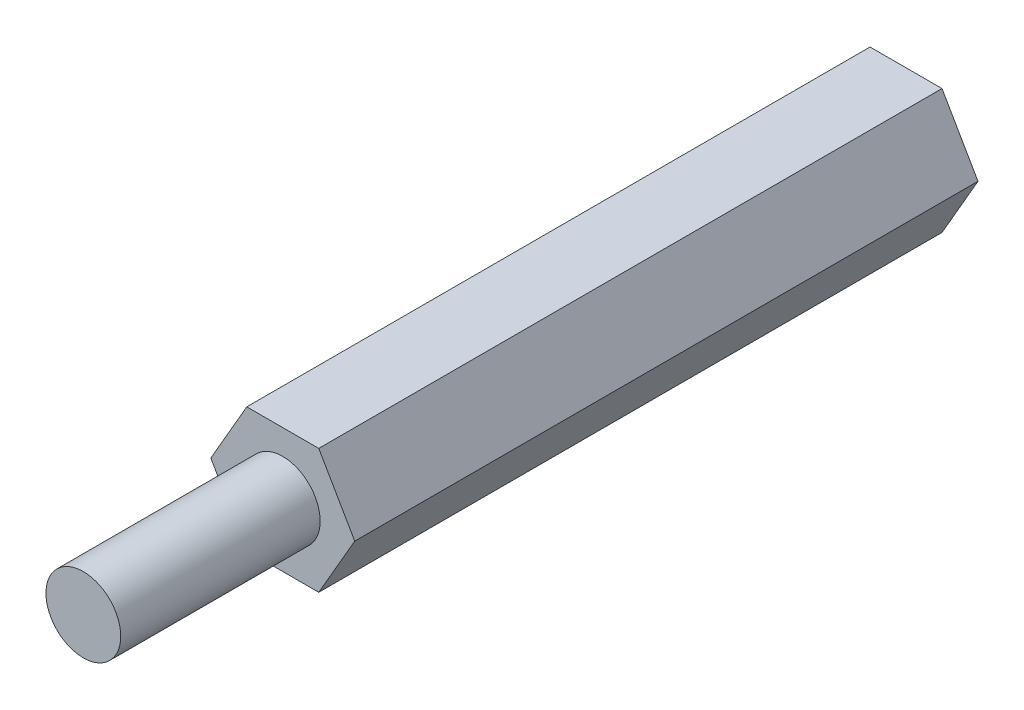
ISO-10303-21;
HEADER;
FILE_DESCRIPTION(('STEP AP214'),'2;1');
FILE_NAME('part.step','',(''),(''),'','','');
FILE_SCHEMA(('AUTOMOTIVE_DESIGN { 1 0 10303 214 1 1 1 1 }'));
ENDSEC;
DATA;
#1=APPLICATION_CONTEXT('core data for automotive mechanical design processes');
#2=APPLICATION_PROTOCOL_DEFINITION('international standard','automotive_design',2000,#1);
#3=PRODUCT_CONTEXT('',#1,'mechanical');
#4=PRODUCT('Part','Part','',(#3));
#5=PRODUCT_RELATED_PRODUCT_CATEGORY('part','',(#4));
#6=PRODUCT_DEFINITION_FORMATION('','',#4);
#7=PRODUCT_DEFINITION_CONTEXT('part definition',#1,'design');
#8=PRODUCT_DEFINITION('design','',#6,#7);
#9=PRODUCT_DEFINITION_SHAPE('','',#8);
#10=(LENGTH_UNIT() NAMED_UNIT(*) SI_UNIT(.MILLI.,.METRE.));
#11=(NAMED_UNIT(*) PLANE_ANGLE_UNIT() SI_UNIT($,.RADIAN.));
#12=(NAMED_UNIT(*) SI_UNIT($,.STERADIAN.) SOLID_ANGLE_UNIT());
#13=UNCERTAINTY_MEASURE_WITH_UNIT(LENGTH_MEASURE(1.E-05),#10,'distance_accuracy_value','');
#14=(GEOMETRIC_REPRESENTATION_CONTEXT(3) GLOBAL_UNCERTAINTY_ASSIGNED_CONTEXT((#13)) GLOBAL_UNIT_ASSIGNED_CONTEXT((#10,
#11,#12)) REPRESENTATION_CONTEXT('',''));
#15=CARTESIAN_POINT('',(0.,0.,0.));
#16=DIRECTION('',(0.,0.,1.));
#17=DIRECTION('',(1.,0.,0.));
#18=AXIS2_PLACEMENT_3D('',#15,#16,#17);
#19=CARTESIAN_POINT('',(1.44337567297409,-2.49999999999999,25.));
#20=DIRECTION('',(-0.866025403784442,0.499999999999995,0.));
#21=DIRECTION('',(-0.499999999999995,-0.866025403784442,0.));
#22=AXIS2_PLACEMENT_3D('',#19,#20,#21);
#23=PLANE('',#22);
#24=DIRECTION('',(0.499999999999995,0.866025403784442,0.));
#25=VECTOR('',#24,1.);
#26=CARTESIAN_POINT('',(1.44337567297409,-2.49999999999999,0.));
#27=LINE('',#26,#25);
#28=CARTESIAN_POINT('',(1.44337567297409,-2.49999999999999,0.));
#29=VERTEX_POINT('',#28);
#30=CARTESIAN_POINT('',(2.88675134594813,0.,0.));
#31=VERTEX_POINT('',#30);
#32=EDGE_CURVE('E130',#29,#31,#27,.T.);
#33=ORIENTED_EDGE('',*,*,#32,.T.);
#34=DIRECTION('',(0.,0.,-1.));
#35=VECTOR('',#34,1.);
#36=CARTESIAN_POINT('',(2.88675134594813,0.,25.));
#37=LINE('',#36,#35);
#38=CARTESIAN_POINT('',(2.88675134594813,0.,25.));
#39=VERTEX_POINT('',#38);
#40=EDGE_CURVE('E42',#39,#31,#37,.T.);
#41=ORIENTED_EDGE('',*,*,#40,.F.);
#42=DIRECTION('',(0.499999999999995,0.866025403784442,0.));
#43=VECTOR('',#42,1.);
#44=CARTESIAN_POINT('',(1.44337567297409,-2.49999999999999,25.));
#45=LINE('',#44,#43);
#46=CARTESIAN_POINT('',(1.44337567297409,-2.49999999999999,25.));
#47=VERTEX_POINT('',#46);
#48=EDGE_CURVE('E147',#47,#39,#45,.T.);
#49=ORIENTED_EDGE('',*,*,#48,.F.);
#50=DIRECTION('',(0.,0.,-1.));
#51=VECTOR('',#50,1.);
#52=CARTESIAN_POINT('',(1.44337567297409,-2.49999999999999,25.));
#53=LINE('',#52,#51);
#54=EDGE_CURVE('E126',#47,#29,#53,.T.);
#55=ORIENTED_EDGE('',*,*,#54,.T.);
#56=EDGE_LOOP('',(#33,#41,#49,#55));
#57=FACE_BOUND('',#56,.T.);
#58=ADVANCED_FACE('F39',(#57),#23,.F.);
#59=CARTESIAN_POINT('',(2.88675134594813,0.,25.));
#60=DIRECTION('',(-0.866025403784438,-0.500000000000001,0.));
#61=DIRECTION('',(0.500000000000001,-0.866025403784438,0.));
#62=AXIS2_PLACEMENT_3D('',#59,#60,#61);
#63=PLANE('',#62);
#64=DIRECTION('',(-0.500000000000001,0.866025403784438,0.));
#65=VECTOR('',#64,1.);
#66=CARTESIAN_POINT('',(2.88675134594813,0.,0.));
#67=LINE('',#66,#65);
#68=CARTESIAN_POINT('',(1.44337567297406,2.50000000000001,0.));
#69=VERTEX_POINT('',#68);
#70=EDGE_CURVE('E134',#31,#69,#67,.T.);
#71=ORIENTED_EDGE('',*,*,#70,.T.);
#72=DIRECTION('',(0.,0.,-1.));
#73=VECTOR('',#72,1.);
#74=CARTESIAN_POINT('',(1.44337567297406,2.50000000000001,25.));
#75=LINE('',#74,#73);
#76=CARTESIAN_POINT('',(1.44337567297406,2.50000000000001,25.));
#77=VERTEX_POINT('',#76);
#78=EDGE_CURVE('E153',#77,#69,#75,.T.);
#79=ORIENTED_EDGE('',*,*,#78,.F.);
#80=DIRECTION('',(-0.500000000000001,0.866025403784438,0.));
#81=VECTOR('',#80,1.);
#82=CARTESIAN_POINT('',(2.88675134594813,0.,25.));
#83=LINE('',#82,#81);
#84=EDGE_CURVE('E95',#39,#77,#83,.T.);
#85=ORIENTED_EDGE('',*,*,#84,.F.);
#86=ORIENTED_EDGE('',*,*,#40,.T.);
#87=EDGE_LOOP('',(#71,#79,#85,#86));
#88=FACE_BOUND('',#87,.T.);
#89=ADVANCED_FACE('F160',(#88),#63,.F.);
#90=CARTESIAN_POINT('',(1.44337567297406,2.50000000000001,25.));
#91=DIRECTION('',(0.,-1.,0.));
#92=DIRECTION('',(1.,0.,0.));
#93=AXIS2_PLACEMENT_3D('',#90,#91,#92);
#94=PLANE('',#93);
#95=DIRECTION('',(-1.,0.,0.));
#96=VECTOR('',#95,1.);
#97=CARTESIAN_POINT('',(1.44337567297406,2.50000000000001,0.));
#98=LINE('',#97,#96);
#99=CARTESIAN_POINT('',(-1.44337567297408,2.5,0.));
#100=VERTEX_POINT('',#99);
#101=EDGE_CURVE('E138',#69,#100,#98,.T.);
#102=ORIENTED_EDGE('',*,*,#101,.T.);
#103=DIRECTION('',(0.,0.,-1.));
#104=VECTOR('',#103,1.);
#105=CARTESIAN_POINT('',(-1.44337567297408,2.5,25.));
#106=LINE('',#105,#104);
#107=CARTESIAN_POINT('',(-1.44337567297408,2.5,25.));
#108=VERTEX_POINT('',#107);
#109=EDGE_CURVE('E119',#108,#100,#106,.T.);
#110=ORIENTED_EDGE('',*,*,#109,.F.);
#111=DIRECTION('',(-1.,0.,0.));
#112=VECTOR('',#111,1.);
#113=CARTESIAN_POINT('',(1.44337567297406,2.50000000000001,25.));
#114=LINE('',#113,#112);
#115=EDGE_CURVE('E108',#77,#108,#114,.T.);
#116=ORIENTED_EDGE('',*,*,#115,.F.);
#117=ORIENTED_EDGE('',*,*,#78,.T.);
#118=EDGE_LOOP('',(#102,#110,#116,#117));
#119=FACE_BOUND('',#118,.T.);
#120=ADVANCED_FACE('F166',(#119),#94,.F.);
#121=CARTESIAN_POINT('',(-1.44337567297408,2.5,25.));
#122=DIRECTION('',(0.866025403784442,-0.499999999999995,0.));
#123=DIRECTION('',(0.499999999999995,0.866025403784442,0.));
#124=AXIS2_PLACEMENT_3D('',#121,#122,#123);
#125=PLANE('',#124);
#126=DIRECTION('',(-0.499999999999995,-0.866025403784442,0.));
#127=VECTOR('',#126,1.);
#128=CARTESIAN_POINT('',(-1.44337567297408,2.5,0.));
#129=LINE('',#128,#127);
#130=CARTESIAN_POINT('',(-2.88675134594813,0.,0.));
#131=VERTEX_POINT('',#130);
#132=EDGE_CURVE('E117',#100,#131,#129,.T.);
#133=ORIENTED_EDGE('',*,*,#132,.T.);
#134=DIRECTION('',(0.,0.,-1.));
#135=VECTOR('',#134,1.);
#136=CARTESIAN_POINT('',(-2.88675134594813,0.,25.));
#137=LINE('',#136,#135);
#138=CARTESIAN_POINT('',(-2.88675134594813,0.,25.));
#139=VERTEX_POINT('',#138);
#140=EDGE_CURVE('E114',#139,#131,#137,.T.);
#141=ORIENTED_EDGE('',*,*,#140,.F.);
#142=DIRECTION('',(-0.499999999999995,-0.866025403784442,0.));
#143=VECTOR('',#142,1.);
#144=CARTESIAN_POINT('',(-1.44337567297408,2.5,25.));
#145=LINE('',#144,#143);
#146=EDGE_CURVE('E102',#108,#139,#145,.T.);
#147=ORIENTED_EDGE('',*,*,#146,.F.);
#148=ORIENTED_EDGE('',*,*,#109,.T.);
#149=EDGE_LOOP('',(#133,#141,#147,#148));
#150=FACE_BOUND('',#149,.T.);
#151=ADVANCED_FACE('F115',(#150),#125,.F.);
#152=CARTESIAN_POINT('',(-2.88675134594813,0.,25.));
#153=DIRECTION('',(0.866025403784435,0.500000000000007,0.));
#154=DIRECTION('',(-0.500000000000007,0.866025403784435,0.));
#155=AXIS2_PLACEMENT_3D('',#152,#153,#154);
#156=PLANE('',#155);
#157=DIRECTION('',(0.500000000000007,-0.866025403784435,0.));
#158=VECTOR('',#157,1.);
#159=CARTESIAN_POINT('',(-2.88675134594813,0.,0.));
#160=LINE('',#159,#158);
#161=CARTESIAN_POINT('',(-1.44337567297404,-2.50000000000002,0.));
#162=VERTEX_POINT('',#161);
#163=EDGE_CURVE('E80',#131,#162,#160,.T.);
#164=ORIENTED_EDGE('',*,*,#163,.T.);
#165=DIRECTION('',(0.,0.,-1.));
#166=VECTOR('',#165,1.);
#167=CARTESIAN_POINT('',(-1.44337567297404,-2.50000000000002,25.));
#168=LINE('',#167,#166);
#169=CARTESIAN_POINT('',(-1.44337567297404,-2.50000000000002,25.));
#170=VERTEX_POINT('',#169);
#171=EDGE_CURVE('E120',#170,#162,#168,.T.);
#172=ORIENTED_EDGE('',*,*,#171,.F.);
#173=DIRECTION('',(0.500000000000007,-0.866025403784435,0.));
#174=VECTOR('',#173,1.);
#175=CARTESIAN_POINT('',(-2.88675134594813,0.,25.));
#176=LINE('',#175,#174);
#177=EDGE_CURVE('E106',#139,#170,#176,.T.);
#178=ORIENTED_EDGE('',*,*,#177,.F.);
#179=ORIENTED_EDGE('',*,*,#140,.T.);
#180=EDGE_LOOP('',(#164,#172,#178,#179));
#181=FACE_BOUND('',#180,.T.);
#182=ADVANCED_FACE('F122',(#181),#156,.F.);
#183=CARTESIAN_POINT('',(-1.44337567297404,-2.50000000000002,25.));
#184=DIRECTION('',(0.,1.,0.));
#185=DIRECTION('',(-1.,0.,0.));
#186=AXIS2_PLACEMENT_3D('',#183,#184,#185);
#187=PLANE('',#186);
#188=DIRECTION('',(1.,0.,0.));
#189=VECTOR('',#188,1.);
#190=CARTESIAN_POINT('',(-1.44337567297404,-2.50000000000002,0.));
#191=LINE('',#190,#189);
#192=EDGE_CURVE('E86',#162,#29,#191,.T.);
#193=ORIENTED_EDGE('',*,*,#192,.T.);
#194=ORIENTED_EDGE('',*,*,#54,.F.);
#195=DIRECTION('',(1.,0.,0.));
#196=VECTOR('',#195,1.);
#197=CARTESIAN_POINT('',(-1.44337567297404,-2.50000000000002,25.));
#198=LINE('',#197,#196);
#199=EDGE_CURVE('E57',#170,#47,#198,.T.);
#200=ORIENTED_EDGE('',*,*,#199,.F.);
#201=ORIENTED_EDGE('',*,*,#171,.T.);
#202=EDGE_LOOP('',(#193,#194,#200,#201));
#203=FACE_BOUND('',#202,.T.);
#204=ADVANCED_FACE('F203',(#203),#187,.F.);
#205=CARTESIAN_POINT('',(0.,0.,25.));
#206=DIRECTION('',(0.,0.,1.));
#207=DIRECTION('',(1.,0.,0.));
#208=AXIS2_PLACEMENT_3D('',#205,#206,#207);
#209=PLANE('',#208);
#210=CARTESIAN_POINT('',(0.,0.,25.));
#211=DIRECTION('',(0.,0.,1.));
#212=DIRECTION('',(1.,0.,0.));
#213=AXIS2_PLACEMENT_3D('',#210,#211,#212);
#214=CIRCLE('',#213,1.5);
#215=CARTESIAN_POINT('',(1.5,0.,25.));
#216=VERTEX_POINT('',#215);
#217=EDGE_CURVE('E11',#216,#216,#214,.T.);
#218=ORIENTED_EDGE('',*,*,#217,.F.);
#219=EDGE_LOOP('',(#218));
#220=FACE_BOUND('',#219,.T.);
#221=ORIENTED_EDGE('',*,*,#48,.T.);
#222=ORIENTED_EDGE('',*,*,#84,.T.);
#223=ORIENTED_EDGE('',*,*,#115,.T.);
#224=ORIENTED_EDGE('',*,*,#146,.T.);
#225=ORIENTED_EDGE('',*,*,#177,.T.);
#226=ORIENTED_EDGE('',*,*,#199,.T.);
#227=EDGE_LOOP('',(#221,#222,#223,#224,#225,#226));
#228=FACE_BOUND('',#227,.T.);
#229=ADVANCED_FACE('F104',(#220,#228),#209,.T.);
#230=CARTESIAN_POINT('',(0.,0.,0.));
#231=DIRECTION('',(0.,0.,1.));
#232=DIRECTION('',(1.,0.,0.));
#233=AXIS2_PLACEMENT_3D('',#230,#231,#232);
#234=PLANE('',#233);
#235=CARTESIAN_POINT('',(0.,0.,0.));
#236=DIRECTION('',(0.,0.,-1.));
#237=DIRECTION('',(-1.,0.,0.));
#238=AXIS2_PLACEMENT_3D('',#235,#236,#237);
#239=CIRCLE('',#238,1.5);
#240=CARTESIAN_POINT('',(-1.5,0.,0.));
#241=VERTEX_POINT('',#240);
#242=EDGE_CURVE('E177',#241,#241,#239,.T.);
#243=ORIENTED_EDGE('',*,*,#242,.F.);
#244=EDGE_LOOP('',(#243));
#245=FACE_BOUND('',#244,.T.);
#246=ORIENTED_EDGE('',*,*,#32,.F.);
#247=ORIENTED_EDGE('',*,*,#192,.F.);
#248=ORIENTED_EDGE('',*,*,#163,.F.);
#249=ORIENTED_EDGE('',*,*,#132,.F.);
#250=ORIENTED_EDGE('',*,*,#101,.F.);
#251=ORIENTED_EDGE('',*,*,#70,.F.);
#252=EDGE_LOOP('',(#246,#247,#248,#249,#250,#251));
#253=FACE_BOUND('',#252,.T.);
#254=ADVANCED_FACE('F165',(#245,#253),#234,.F.);
#255=CARTESIAN_POINT('',(0.,0.,33.));
#256=DIRECTION('',(0.,0.,-1.));
#257=DIRECTION('',(-1.,0.,0.));
#258=AXIS2_PLACEMENT_3D('',#255,#256,#257);
#259=CYLINDRICAL_SURFACE('',#258,1.5);
#260=CARTESIAN_POINT('',(0.,0.,33.));
#261=DIRECTION('',(0.,0.,1.));
#262=DIRECTION('',(1.,0.,0.));
#263=AXIS2_PLACEMENT_3D('',#260,#261,#262);
#264=CIRCLE('',#263,1.5);
#265=CARTESIAN_POINT('',(1.5,0.,33.));
#266=VERTEX_POINT('',#265);
#267=EDGE_CURVE('E135',#266,#266,#264,.T.);
#268=ORIENTED_EDGE('',*,*,#267,.F.);
#269=EDGE_LOOP('',(#268));
#270=FACE_BOUND('',#269,.T.);
#271=ORIENTED_EDGE('',*,*,#217,.T.);
#272=EDGE_LOOP('',(#271));
#273=FACE_BOUND('',#272,.T.);
#274=ADVANCED_FACE('F195',(#270,#273),#259,.T.);
#275=CARTESIAN_POINT('',(0.,0.,33.));
#276=DIRECTION('',(0.,0.,1.));
#277=DIRECTION('',(1.,0.,0.));
#278=AXIS2_PLACEMENT_3D('',#275,#276,#277);
#279=PLANE('',#278);
#280=ORIENTED_EDGE('',*,*,#267,.T.);
#281=EDGE_LOOP('',(#280));
#282=FACE_BOUND('',#281,.T.);
#283=ADVANCED_FACE('F190',(#282),#279,.T.);
#284=CARTESIAN_POINT('',(0.,0.,8.));
#285=DIRECTION('',(0.,0.,-1.));
#286=DIRECTION('',(-1.,0.,0.));
#287=AXIS2_PLACEMENT_3D('',#284,#285,#286);
#288=CYLINDRICAL_SURFACE('',#287,1.5);
#289=CARTESIAN_POINT('',(0.,0.,8.));
#290=DIRECTION('',(0.,0.,-1.));
#291=DIRECTION('',(-1.,0.,0.));
#292=AXIS2_PLACEMENT_3D('',#289,#290,#291);
#293=CIRCLE('',#292,1.5);
#294=CARTESIAN_POINT('',(-1.5,0.,8.));
#295=VERTEX_POINT('',#294);
#296=EDGE_CURVE('E176',#295,#295,#293,.T.);
#297=ORIENTED_EDGE('',*,*,#296,.F.);
#298=EDGE_LOOP('',(#297));
#299=FACE_BOUND('',#298,.T.);
#300=ORIENTED_EDGE('',*,*,#242,.T.);
#301=EDGE_LOOP('',(#300));
#302=FACE_BOUND('',#301,.T.);
#303=ADVANCED_FACE('F187',(#299,#302),#288,.F.);
#304=CARTESIAN_POINT('',(0.,0.,8.));
#305=DIRECTION('',(0.,0.,-1.));
#306=DIRECTION('',(-1.,0.,0.));
#307=AXIS2_PLACEMENT_3D('',#304,#305,#306);
#308=PLANE('',#307);
#309=ORIENTED_EDGE('',*,*,#296,.T.);
#310=EDGE_LOOP('',(#309));
#311=FACE_BOUND('',#310,.T.);
#312=ADVANCED_FACE('F185',(#311),#308,.T.);
#313=CLOSED_SHELL('',(#58,#89,#120,#151,#182,#204,#229,#254,#274,#283,#303,#312));
#314=MANIFOLD_SOLID_BREP('B2',#313);
#315=ADVANCED_BREP_SHAPE_REPRESENTATION('',(#18,#314),#14);
#316=SHAPE_DEFINITION_REPRESENTATION(#9,#315);
ENDSEC;
END-ISO-10303-21;
